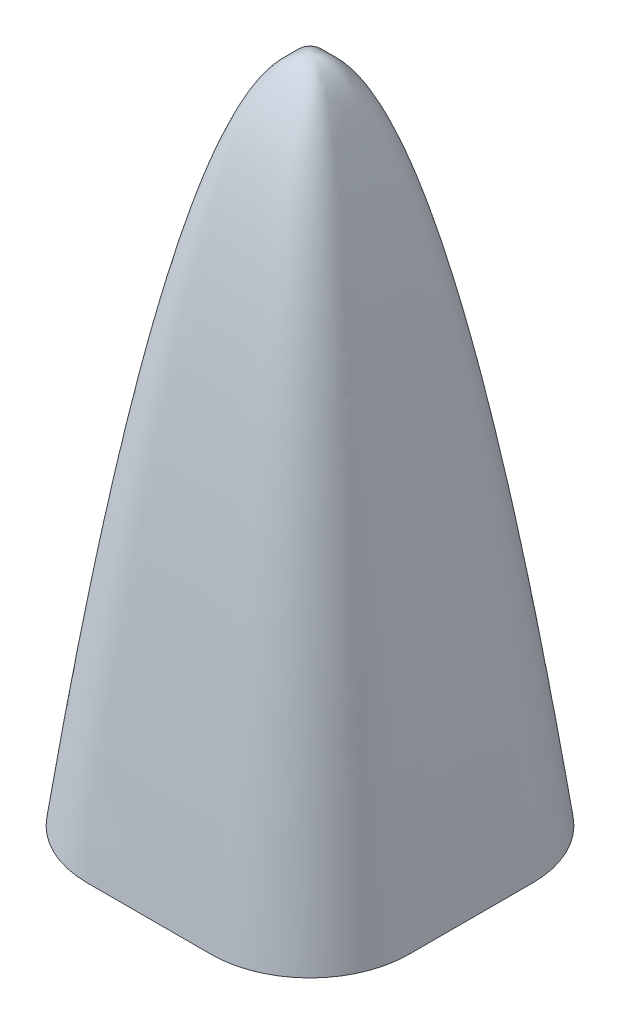
ISO-10303-21;
HEADER;
FILE_DESCRIPTION(('STEP AP214'),'2;1');
FILE_NAME('part.step','',(''),(''),'','','');
FILE_SCHEMA(('AUTOMOTIVE_DESIGN { 1 0 10303 214 1 1 1 1 }'));
ENDSEC;
DATA;
#1=APPLICATION_CONTEXT('core data for automotive mechanical design processes');
#2=APPLICATION_PROTOCOL_DEFINITION('international standard','automotive_design',2000,#1);
#3=PRODUCT_CONTEXT('',#1,'mechanical');
#4=PRODUCT('Part','Part','',(#3));
#5=PRODUCT_RELATED_PRODUCT_CATEGORY('part','',(#4));
#6=PRODUCT_DEFINITION_FORMATION('','',#4);
#7=PRODUCT_DEFINITION_CONTEXT('part definition',#1,'design');
#8=PRODUCT_DEFINITION('design','',#6,#7);
#9=PRODUCT_DEFINITION_SHAPE('','',#8);
#10=(LENGTH_UNIT() NAMED_UNIT(*) SI_UNIT(.MILLI.,.METRE.));
#11=(NAMED_UNIT(*) PLANE_ANGLE_UNIT() SI_UNIT($,.RADIAN.));
#12=(NAMED_UNIT(*) SI_UNIT($,.STERADIAN.) SOLID_ANGLE_UNIT());
#13=UNCERTAINTY_MEASURE_WITH_UNIT(LENGTH_MEASURE(1.E-05),#10,'distance_accuracy_value','');
#14=(GEOMETRIC_REPRESENTATION_CONTEXT(3) GLOBAL_UNCERTAINTY_ASSIGNED_CONTEXT((#13)) GLOBAL_UNIT_ASSIGNED_CONTEXT((#10,
#11,#12)) REPRESENTATION_CONTEXT('',''));
#15=CARTESIAN_POINT('',(0.,0.,0.));
#16=DIRECTION('',(0.,0.,1.));
#17=DIRECTION('',(1.,0.,0.));
#18=AXIS2_PLACEMENT_3D('',#15,#16,#17);
#19=CARTESIAN_POINT('',(-2.5,0.,2.5));
#20=DIRECTION('',(0.,1.,0.));
#21=DIRECTION('',(0.,0.,1.));
#22=AXIS2_PLACEMENT_3D('',#19,#20,#21);
#23=PLANE('',#22);
#24=DIRECTION('',(0.,0.,1.));
#25=VECTOR('',#24,1.);
#26=CARTESIAN_POINT('',(-6.5,0.,-2.49999999999997));
#27=LINE('',#26,#25);
#28=CARTESIAN_POINT('',(-6.5,0.,-2.49999999999997));
#29=VERTEX_POINT('',#28);
#30=CARTESIAN_POINT('',(-6.5,0.,2.49999999999997));
#31=VERTEX_POINT('',#30);
#32=EDGE_CURVE('E205',#29,#31,#27,.T.);
#33=ORIENTED_EDGE('',*,*,#32,.F.);
#34=CARTESIAN_POINT('',(-2.5,0.,-2.5));
#35=DIRECTION('',(0.,1.,0.));
#36=DIRECTION('',(0.,0.,1.));
#37=AXIS2_PLACEMENT_3D('',#34,#35,#36);
#38=CIRCLE('',#37,4.);
#39=CARTESIAN_POINT('',(-2.49999999999997,0.,-6.5));
#40=VERTEX_POINT('',#39);
#41=EDGE_CURVE('E13',#40,#29,#38,.T.);
#42=ORIENTED_EDGE('',*,*,#41,.F.);
#43=DIRECTION('',(1.,0.,0.));
#44=VECTOR('',#43,1.);
#45=CARTESIAN_POINT('',(-2.49999999999997,0.,-6.5));
#46=LINE('',#45,#44);
#47=CARTESIAN_POINT('',(2.49999999999997,0.,-6.5));
#48=VERTEX_POINT('',#47);
#49=EDGE_CURVE('E170',#40,#48,#46,.T.);
#50=ORIENTED_EDGE('',*,*,#49,.T.);
#51=CARTESIAN_POINT('',(2.5,0.,-2.5));
#52=DIRECTION('',(0.,1.,0.));
#53=DIRECTION('',(0.,0.,1.));
#54=AXIS2_PLACEMENT_3D('',#51,#52,#53);
#55=CIRCLE('',#54,4.);
#56=CARTESIAN_POINT('',(6.5,0.,-2.49999999999997));
#57=VERTEX_POINT('',#56);
#58=EDGE_CURVE('E264',#57,#48,#55,.T.);
#59=ORIENTED_EDGE('',*,*,#58,.F.);
#60=DIRECTION('',(0.,0.,1.));
#61=VECTOR('',#60,1.);
#62=CARTESIAN_POINT('',(6.5,0.,-2.49999999999997));
#63=LINE('',#62,#61);
#64=CARTESIAN_POINT('',(6.5,0.,2.49999999999997));
#65=VERTEX_POINT('',#64);
#66=EDGE_CURVE('E254',#57,#65,#63,.T.);
#67=ORIENTED_EDGE('',*,*,#66,.T.);
#68=CARTESIAN_POINT('',(2.5,0.,2.5));
#69=DIRECTION('',(0.,1.,0.));
#70=DIRECTION('',(0.,0.,1.));
#71=AXIS2_PLACEMENT_3D('',#68,#69,#70);
#72=CIRCLE('',#71,4.);
#73=CARTESIAN_POINT('',(2.49999999999997,0.,6.5));
#74=VERTEX_POINT('',#73);
#75=EDGE_CURVE('E243',#74,#65,#72,.T.);
#76=ORIENTED_EDGE('',*,*,#75,.F.);
#77=DIRECTION('',(1.,0.,0.));
#78=VECTOR('',#77,1.);
#79=CARTESIAN_POINT('',(-2.49999999999997,0.,6.5));
#80=LINE('',#79,#78);
#81=CARTESIAN_POINT('',(-2.5,0.,6.5));
#82=VERTEX_POINT('',#81);
#83=EDGE_CURVE('E204',#82,#74,#80,.T.);
#84=ORIENTED_EDGE('',*,*,#83,.F.);
#85=CARTESIAN_POINT('',(-2.5,0.,2.5));
#86=DIRECTION('',(0.,1.,0.));
#87=DIRECTION('',(0.,0.,1.));
#88=AXIS2_PLACEMENT_3D('',#85,#86,#87);
#89=CIRCLE('',#88,4.);
#90=EDGE_CURVE('E199',#31,#82,#89,.T.);
#91=ORIENTED_EDGE('',*,*,#90,.F.);
#92=EDGE_LOOP('',(#33,#42,#50,#59,#67,#76,#84,#91));
#93=FACE_BOUND('',#92,.T.);
#94=ADVANCED_FACE('F152',(#93),#23,.F.);
#95=CARTESIAN_POINT('',(6.5,0.,0.));
#96=CARTESIAN_POINT('',(4.33333333333333,18.,0.));
#97=CARTESIAN_POINT('',(2.16666666666667,27.,0.));
#98=CARTESIAN_POINT('',(0.,27.,0.));
#99=CARTESIAN_POINT('',(6.5,0.,-0.208333333333331));
#100=CARTESIAN_POINT('',(4.33333333333333,18.,-0.138888888888887));
#101=CARTESIAN_POINT('',(2.16666666666667,27.,-0.0694444444444437));
#102=CARTESIAN_POINT('',(0.,27.,0.));
#103=CARTESIAN_POINT('',(6.5,0.,-0.624999999999992));
#104=CARTESIAN_POINT('',(4.33333333333333,18.,-0.416666666666662));
#105=CARTESIAN_POINT('',(2.16666666666667,27.,-0.208333333333331));
#106=CARTESIAN_POINT('',(0.,27.,0.));
#107=CARTESIAN_POINT('',(6.5,0.,-1.24999999999999));
#108=CARTESIAN_POINT('',(4.33333333333334,18.,-0.833333333333324));
#109=CARTESIAN_POINT('',(2.16666666666667,27.,-0.416666666666662));
#110=CARTESIAN_POINT('',(0.,27.,0.));
#111=CARTESIAN_POINT('',(6.5,0.,-1.87499999999998));
#112=CARTESIAN_POINT('',(4.33333333333333,18.,-1.24999999999999));
#113=CARTESIAN_POINT('',(2.16666666666667,27.,-0.624999999999993));
#114=CARTESIAN_POINT('',(0.,27.,0.));
#115=CARTESIAN_POINT('',(6.5,0.,-2.29166666666664));
#116=CARTESIAN_POINT('',(4.33333333333333,18.,-1.52777777777776));
#117=CARTESIAN_POINT('',(2.16666666666667,27.,-0.76388888888888));
#118=CARTESIAN_POINT('',(0.,27.,0.));
#119=CARTESIAN_POINT('',(6.50000000000001,0.,-3.02359877219142));
#120=CARTESIAN_POINT('',(4.33333333333334,18.,-2.01573251479428));
#121=CARTESIAN_POINT('',(2.16666666666667,27.,-1.00786625739714));
#122=CARTESIAN_POINT('',(0.,27.,0.));
#123=CARTESIAN_POINT('',(6.29196002703282,0.,-4.07062167964767));
#124=CARTESIAN_POINT('',(4.19464001802188,18.,-2.71374778643178));
#125=CARTESIAN_POINT('',(2.09732000901094,27.,-1.35687389321589));
#126=CARTESIAN_POINT('',(0.,27.,0.));
#127=CARTESIAN_POINT('',(5.40212765733192,0.,-5.40212765733193));
#128=CARTESIAN_POINT('',(3.60141843822128,18.,-3.60141843822128));
#129=CARTESIAN_POINT('',(1.80070921911064,27.,-1.80070921911064));
#130=CARTESIAN_POINT('',(0.,27.,0.));
#131=CARTESIAN_POINT('',(4.07062167964768,0.,-6.29196002703281));
#132=CARTESIAN_POINT('',(2.71374778643178,18.,-4.19464001802187));
#133=CARTESIAN_POINT('',(1.35687389321589,27.,-2.09732000901094));
#134=CARTESIAN_POINT('',(0.,27.,0.));
#135=CARTESIAN_POINT('',(3.02359877219142,0.,-6.5));
#136=CARTESIAN_POINT('',(2.01573251479428,18.,-4.33333333333333));
#137=CARTESIAN_POINT('',(1.00786625739714,27.,-2.16666666666667));
#138=CARTESIAN_POINT('',(0.,27.,0.));
#139=CARTESIAN_POINT('',(2.08333333333331,0.,-6.5));
#140=CARTESIAN_POINT('',(1.38888888888887,18.,-4.33333333333333));
#141=CARTESIAN_POINT('',(0.694444444444437,27.,-2.16666666666667));
#142=CARTESIAN_POINT('',(0.,27.,0.));
#143=CARTESIAN_POINT('',(1.24999999999999,0.,-6.5));
#144=CARTESIAN_POINT('',(0.833333333333325,18.,-4.33333333333333));
#145=CARTESIAN_POINT('',(0.416666666666662,27.,-2.16666666666667));
#146=CARTESIAN_POINT('',(0.,27.,0.));
#147=CARTESIAN_POINT('',(0.,0.,-6.5));
#148=CARTESIAN_POINT('',(0.,18.,-4.33333333333333));
#149=CARTESIAN_POINT('',(0.,27.,-2.16666666666667));
#150=CARTESIAN_POINT('',(0.,27.,0.));
#151=CARTESIAN_POINT('',(-1.24999999999998,0.,-6.5));
#152=CARTESIAN_POINT('',(-0.833333333333322,18.,-4.33333333333333));
#153=CARTESIAN_POINT('',(-0.416666666666661,27.,-2.16666666666667));
#154=CARTESIAN_POINT('',(0.,27.,0.));
#155=CARTESIAN_POINT('',(-2.08333333333331,0.,-6.5));
#156=CARTESIAN_POINT('',(-1.38888888888887,18.,-4.33333333333333));
#157=CARTESIAN_POINT('',(-0.694444444444437,27.,-2.16666666666667));
#158=CARTESIAN_POINT('',(0.,27.,0.));
#159=CARTESIAN_POINT('',(-3.02359877219142,0.,-6.5));
#160=CARTESIAN_POINT('',(-2.01573251479428,18.,-4.33333333333334));
#161=CARTESIAN_POINT('',(-1.00786625739714,27.,-2.16666666666667));
#162=CARTESIAN_POINT('',(0.,27.,0.));
#163=CARTESIAN_POINT('',(-4.07062167964768,0.,-6.29196002703281));
#164=CARTESIAN_POINT('',(-2.71374778643179,18.,-4.19464001802187));
#165=CARTESIAN_POINT('',(-1.35687389321589,27.,-2.09732000901094));
#166=CARTESIAN_POINT('',(0.,27.,0.));
#167=CARTESIAN_POINT('',(-5.40212765733191,0.,-5.40212765733192));
#168=CARTESIAN_POINT('',(-3.60141843822127,18.,-3.60141843822128));
#169=CARTESIAN_POINT('',(-1.80070921911064,27.,-1.80070921911064));
#170=CARTESIAN_POINT('',(0.,27.,0.));
#171=CARTESIAN_POINT('',(-6.29196002703282,0.,-4.07062167964767));
#172=CARTESIAN_POINT('',(-4.19464001802188,18.,-2.71374778643178));
#173=CARTESIAN_POINT('',(-2.09732000901094,27.,-1.35687389321589));
#174=CARTESIAN_POINT('',(0.,27.,0.));
#175=CARTESIAN_POINT('',(-6.5,0.,-3.02359877219142));
#176=CARTESIAN_POINT('',(-4.33333333333334,18.,-2.01573251479428));
#177=CARTESIAN_POINT('',(-2.16666666666667,27.,-1.00786625739714));
#178=CARTESIAN_POINT('',(0.,27.,0.));
#179=CARTESIAN_POINT('',(-6.5,0.,-2.08333333333331));
#180=CARTESIAN_POINT('',(-4.33333333333333,18.,-1.38888888888887));
#181=CARTESIAN_POINT('',(-2.16666666666667,27.,-0.694444444444436));
#182=CARTESIAN_POINT('',(0.,27.,0.));
#183=CARTESIAN_POINT('',(-6.5,0.,-1.24999999999999));
#184=CARTESIAN_POINT('',(-4.33333333333333,18.,-0.833333333333324));
#185=CARTESIAN_POINT('',(-2.16666666666667,27.,-0.416666666666662));
#186=CARTESIAN_POINT('',(0.,27.,0.));
#187=CARTESIAN_POINT('',(-6.5,0.,0.));
#188=CARTESIAN_POINT('',(-4.33333333333333,18.,0.));
#189=CARTESIAN_POINT('',(-2.16666666666667,27.,0.));
#190=CARTESIAN_POINT('',(0.,27.,0.));
#191=CARTESIAN_POINT('',(-6.50000000000001,0.,1.24999999999999));
#192=CARTESIAN_POINT('',(-4.33333333333334,18.,0.833333333333324));
#193=CARTESIAN_POINT('',(-2.16666666666667,27.,0.416666666666662));
#194=CARTESIAN_POINT('',(0.,27.,0.));
#195=CARTESIAN_POINT('',(-6.5,0.,2.08333333333331));
#196=CARTESIAN_POINT('',(-4.33333333333333,18.,1.38888888888887));
#197=CARTESIAN_POINT('',(-2.16666666666667,27.,0.694444444444436));
#198=CARTESIAN_POINT('',(0.,27.,0.));
#199=CARTESIAN_POINT('',(-6.5,0.,3.02359877219142));
#200=CARTESIAN_POINT('',(-4.33333333333334,18.,2.01573251479428));
#201=CARTESIAN_POINT('',(-2.16666666666667,27.,1.00786625739714));
#202=CARTESIAN_POINT('',(0.,27.,0.));
#203=CARTESIAN_POINT('',(-6.29196002703282,0.,4.07062167964766));
#204=CARTESIAN_POINT('',(-4.19464001802188,18.,2.71374778643177));
#205=CARTESIAN_POINT('',(-2.09732000901094,27.,1.35687389321589));
#206=CARTESIAN_POINT('',(0.,27.,0.));
#207=CARTESIAN_POINT('',(-5.40212765733193,0.,5.40212765733191));
#208=CARTESIAN_POINT('',(-3.60141843822129,18.,3.60141843822127));
#209=CARTESIAN_POINT('',(-1.80070921911064,27.,1.80070921911064));
#210=CARTESIAN_POINT('',(0.,27.,0.));
#211=CARTESIAN_POINT('',(-4.07062167964769,0.,6.2919600270328));
#212=CARTESIAN_POINT('',(-2.71374778643179,18.,4.19464001802187));
#213=CARTESIAN_POINT('',(-1.3568738932159,27.,2.09732000901093));
#214=CARTESIAN_POINT('',(0.,27.,0.));
#215=CARTESIAN_POINT('',(-3.02359877219145,0.,6.5));
#216=CARTESIAN_POINT('',(-2.0157325147943,18.,4.33333333333333));
#217=CARTESIAN_POINT('',(-1.00786625739715,27.,2.16666666666667));
#218=CARTESIAN_POINT('',(0.,27.,0.));
#219=CARTESIAN_POINT('',(-2.08333333333334,0.,6.5));
#220=CARTESIAN_POINT('',(-1.38888888888889,18.,4.33333333333333));
#221=CARTESIAN_POINT('',(-0.694444444444445,27.,2.16666666666667));
#222=CARTESIAN_POINT('',(0.,27.,0.));
#223=CARTESIAN_POINT('',(-1.25000000000001,0.,6.49999999999999));
#224=CARTESIAN_POINT('',(-0.833333333333338,18.,4.33333333333333));
#225=CARTESIAN_POINT('',(-0.416666666666669,27.,2.16666666666666));
#226=CARTESIAN_POINT('',(0.,27.,0.));
#227=CARTESIAN_POINT('',(0.,0.,6.50000000000001));
#228=CARTESIAN_POINT('',(0.,18.,4.33333333333334));
#229=CARTESIAN_POINT('',(0.,27.,2.16666666666667));
#230=CARTESIAN_POINT('',(0.,27.,0.));
#231=CARTESIAN_POINT('',(1.24999999999998,0.,6.5));
#232=CARTESIAN_POINT('',(0.833333333333319,18.,4.33333333333333));
#233=CARTESIAN_POINT('',(0.416666666666659,27.,2.16666666666667));
#234=CARTESIAN_POINT('',(0.,27.,0.));
#235=CARTESIAN_POINT('',(2.08333333333331,0.,6.5));
#236=CARTESIAN_POINT('',(1.38888888888887,18.,4.33333333333333));
#237=CARTESIAN_POINT('',(0.694444444444436,27.,2.16666666666667));
#238=CARTESIAN_POINT('',(0.,27.,0.));
#239=CARTESIAN_POINT('',(3.02359877219142,0.,6.5));
#240=CARTESIAN_POINT('',(2.01573251479428,18.,4.33333333333334));
#241=CARTESIAN_POINT('',(1.00786625739714,27.,2.16666666666667));
#242=CARTESIAN_POINT('',(0.,27.,0.));
#243=CARTESIAN_POINT('',(4.07062167964767,0.,6.29196002703282));
#244=CARTESIAN_POINT('',(2.71374778643178,18.,4.19464001802188));
#245=CARTESIAN_POINT('',(1.35687389321589,27.,2.09732000901094));
#246=CARTESIAN_POINT('',(0.,27.,0.));
#247=CARTESIAN_POINT('',(5.40212765733192,0.,5.40212765733192));
#248=CARTESIAN_POINT('',(3.60141843822128,18.,3.60141843822128));
#249=CARTESIAN_POINT('',(1.80070921911064,27.,1.80070921911064));
#250=CARTESIAN_POINT('',(0.,27.,0.));
#251=CARTESIAN_POINT('',(6.29196002703282,0.,4.07062167964767));
#252=CARTESIAN_POINT('',(4.19464001802188,18.,2.71374778643178));
#253=CARTESIAN_POINT('',(2.09732000901094,27.,1.35687389321589));
#254=CARTESIAN_POINT('',(0.,27.,0.));
#255=CARTESIAN_POINT('',(6.5,0.,3.02359877219142));
#256=CARTESIAN_POINT('',(4.33333333333334,18.,2.01573251479428));
#257=CARTESIAN_POINT('',(2.16666666666667,27.,1.00786625739714));
#258=CARTESIAN_POINT('',(0.,27.,0.));
#259=CARTESIAN_POINT('',(6.5,0.,2.29166666666664));
#260=CARTESIAN_POINT('',(4.33333333333333,18.,1.52777777777776));
#261=CARTESIAN_POINT('',(2.16666666666667,27.,0.76388888888888));
#262=CARTESIAN_POINT('',(0.,27.,0.));
#263=CARTESIAN_POINT('',(6.50000000000001,0.,1.87499999999998));
#264=CARTESIAN_POINT('',(4.33333333333334,18.,1.24999999999999));
#265=CARTESIAN_POINT('',(2.16666666666667,27.,0.624999999999993));
#266=CARTESIAN_POINT('',(0.,27.,0.));
#267=CARTESIAN_POINT('',(6.49999999999999,0.,1.24999999999998));
#268=CARTESIAN_POINT('',(4.33333333333333,18.,0.833333333333323));
#269=CARTESIAN_POINT('',(2.16666666666666,27.,0.416666666666661));
#270=CARTESIAN_POINT('',(0.,27.,0.));
#271=CARTESIAN_POINT('',(6.50000000000001,0.,0.624999999999994));
#272=CARTESIAN_POINT('',(4.33333333333334,18.,0.416666666666663));
#273=CARTESIAN_POINT('',(2.16666666666667,27.,0.208333333333331));
#274=CARTESIAN_POINT('',(0.,27.,0.));
#275=CARTESIAN_POINT('',(6.5,0.,0.208333333333332));
#276=CARTESIAN_POINT('',(4.33333333333333,18.,0.138888888888888));
#277=CARTESIAN_POINT('',(2.16666666666667,27.,0.0694444444444439));
#278=CARTESIAN_POINT('',(0.,27.,0.));
#279=CARTESIAN_POINT('',(6.5,0.,0.));
#280=CARTESIAN_POINT('',(4.33333333333333,18.,0.));
#281=CARTESIAN_POINT('',(2.16666666666667,27.,0.));
#282=CARTESIAN_POINT('',(0.,27.,0.));
#283=B_SPLINE_SURFACE_WITH_KNOTS('',3,3,((#95,#96,#97,#98),(#99,#100,#101,#102),(#103,#104,#105,
#106),(#107,#108,#109,#110),(#111,#112,#113,#114),(#115,#116,#117,#118),(#119,#120,#121,#122),
(#123,#124,#125,#126),(#127,#128,#129,#130),(#131,#132,#133,#134),(#135,#136,#137,#138),(#139,
#140,#141,#142),(#143,#144,#145,#146),(#147,#148,#149,#150),(#151,#152,#153,#154),(#155,#156,
#157,#158),(#159,#160,#161,#162),(#163,#164,#165,#166),(#167,#168,#169,#170),(#171,#172,#173,
#174),(#175,#176,#177,#178),(#179,#180,#181,#182),(#183,#184,#185,#186),(#187,#188,#189,#190),
(#191,#192,#193,#194),(#195,#196,#197,#198),(#199,#200,#201,#202),(#203,#204,#205,#206),(#207,
#208,#209,#210),(#211,#212,#213,#214),(#215,#216,#217,#218),(#219,#220,#221,#222),(#223,#224,
#225,#226),(#227,#228,#229,#230),(#231,#232,#233,#234),(#235,#236,#237,#238),(#239,#240,#241,
#242),(#243,#244,#245,#246),(#247,#248,#249,#250),(#251,#252,#253,#254),(#255,#256,#257,#258),
(#259,#260,#261,#262),(#263,#264,#265,#266),(#267,#268,#269,#270),(#271,#272,#273,#274),(#275,
#276,#277,#278),(#279,#280,#281,#282)),.UNSPECIFIED.,.T.,.F.,.F.,(4,1,1,1,2,1,1,1,2,1,1,1,2,1,1,
1,2,1,1,1,2,1,1,1,2,1,1,1,2,1,1,1,2,1,1,1,4),(4,4),(0.,0.0138480398704943,0.0276960797409886,
0.0415441196114829,0.0553921594819771,0.0901960797409886,0.125,0.159803920259011,
0.194607840518023,0.222303920259011,0.25,0.277696079740989,0.305392159481977,0.340196079740989,
0.375,0.409803920259011,0.444607840518023,0.472303920259011,0.5,0.527696079740989,
0.555392159481977,0.590196079740988,0.625,0.659803920259011,0.694607840518022,0.722303920259011,
0.75,0.777696079740988,0.805392159481977,0.840196079740988,0.875,0.909803920259012,
0.944607840518023,0.958455880388517,0.972303920259012,0.986151960129506,1.),(0.,1.),.UNSPECIFIED.);
#284=CARTESIAN_POINT('',(0.,0.,6.5));
#285=CARTESIAN_POINT('',(0.,18.,4.33333333333333));
#286=CARTESIAN_POINT('',(0.,27.,2.16666666666667));
#287=CARTESIAN_POINT('',(0.,27.,0.));
#288=CARTESIAN_POINT('',(0.416666666666648,0.,6.5));
#289=CARTESIAN_POINT('',(0.277777777777765,18.,4.33333333333333));
#290=CARTESIAN_POINT('',(0.138888888888882,27.,2.16666666666667));
#291=CARTESIAN_POINT('',(0.,27.,0.));
#292=CARTESIAN_POINT('',(1.24999999999998,0.,6.5));
#293=CARTESIAN_POINT('',(0.833333333333319,18.,4.33333333333333));
#294=CARTESIAN_POINT('',(0.416666666666659,27.,2.16666666666667));
#295=CARTESIAN_POINT('',(0.,27.,0.));
#296=CARTESIAN_POINT('',(2.08333333333331,0.,6.5));
#297=CARTESIAN_POINT('',(1.38888888888887,18.,4.33333333333333));
#298=CARTESIAN_POINT('',(0.694444444444436,27.,2.16666666666667));
#299=CARTESIAN_POINT('',(0.,27.,0.));
#300=CARTESIAN_POINT('',(3.02359877219142,0.,6.5));
#301=CARTESIAN_POINT('',(2.01573251479428,18.,4.33333333333334));
#302=CARTESIAN_POINT('',(1.00786625739714,27.,2.16666666666667));
#303=CARTESIAN_POINT('',(0.,27.,0.));
#304=CARTESIAN_POINT('',(4.07062167964767,0.,6.29196002703282));
#305=CARTESIAN_POINT('',(2.71374778643178,18.,4.19464001802188));
#306=CARTESIAN_POINT('',(1.35687389321589,27.,2.09732000901094));
#307=CARTESIAN_POINT('',(0.,27.,0.));
#308=CARTESIAN_POINT('',(5.40212765733192,0.,5.40212765733192));
#309=CARTESIAN_POINT('',(3.60141843822128,18.,3.60141843822128));
#310=CARTESIAN_POINT('',(1.80070921911064,27.,1.80070921911064));
#311=CARTESIAN_POINT('',(0.,27.,0.));
#312=CARTESIAN_POINT('',(6.29196002703282,0.,4.07062167964767));
#313=CARTESIAN_POINT('',(4.19464001802188,18.,2.71374778643178));
#314=CARTESIAN_POINT('',(2.09732000901094,27.,1.35687389321589));
#315=CARTESIAN_POINT('',(0.,27.,0.));
#316=CARTESIAN_POINT('',(6.5,0.,3.02359877219142));
#317=CARTESIAN_POINT('',(4.33333333333334,18.,2.01573251479428));
#318=CARTESIAN_POINT('',(2.16666666666667,27.,1.00786625739714));
#319=CARTESIAN_POINT('',(0.,27.,0.));
#320=CARTESIAN_POINT('',(6.5,0.,2.29166666666664));
#321=CARTESIAN_POINT('',(4.33333333333333,18.,1.52777777777776));
#322=CARTESIAN_POINT('',(2.16666666666667,27.,0.76388888888888));
#323=CARTESIAN_POINT('',(0.,27.,0.));
#324=CARTESIAN_POINT('',(6.50000000000001,0.,1.87499999999998));
#325=CARTESIAN_POINT('',(4.33333333333334,18.,1.24999999999999));
#326=CARTESIAN_POINT('',(2.16666666666667,27.,0.624999999999993));
#327=CARTESIAN_POINT('',(0.,27.,0.));
#328=CARTESIAN_POINT('',(6.49999999999999,0.,1.24999999999998));
#329=CARTESIAN_POINT('',(4.33333333333333,18.,0.833333333333323));
#330=CARTESIAN_POINT('',(2.16666666666666,27.,0.416666666666661));
#331=CARTESIAN_POINT('',(0.,27.,0.));
#332=CARTESIAN_POINT('',(6.50000000000001,0.,0.624999999999994));
#333=CARTESIAN_POINT('',(4.33333333333334,18.,0.416666666666663));
#334=CARTESIAN_POINT('',(2.16666666666667,27.,0.208333333333331));
#335=CARTESIAN_POINT('',(0.,27.,0.));
#336=CARTESIAN_POINT('',(6.5,0.,0.208333333333332));
#337=CARTESIAN_POINT('',(4.33333333333333,18.,0.138888888888888));
#338=CARTESIAN_POINT('',(2.16666666666667,27.,0.0694444444444439));
#339=CARTESIAN_POINT('',(0.,27.,0.));
#340=CARTESIAN_POINT('',(6.5,0.,0.));
#341=CARTESIAN_POINT('',(4.33333333333333,18.,0.));
#342=CARTESIAN_POINT('',(2.16666666666667,27.,0.));
#343=CARTESIAN_POINT('',(0.,27.,0.));
#344=CARTESIAN_POINT('',(6.5,0.,-0.208333333333331));
#345=CARTESIAN_POINT('',(4.33333333333333,18.,-0.138888888888887));
#346=CARTESIAN_POINT('',(2.16666666666667,27.,-0.0694444444444437));
#347=CARTESIAN_POINT('',(0.,27.,0.));
#348=CARTESIAN_POINT('',(6.5,0.,-0.624999999999992));
#349=CARTESIAN_POINT('',(4.33333333333333,18.,-0.416666666666662));
#350=CARTESIAN_POINT('',(2.16666666666667,27.,-0.208333333333331));
#351=CARTESIAN_POINT('',(0.,27.,0.));
#352=CARTESIAN_POINT('',(6.5,0.,-1.24999999999999));
#353=CARTESIAN_POINT('',(4.33333333333334,18.,-0.833333333333324));
#354=CARTESIAN_POINT('',(2.16666666666667,27.,-0.416666666666662));
#355=CARTESIAN_POINT('',(0.,27.,0.));
#356=CARTESIAN_POINT('',(6.5,0.,-1.87499999999998));
#357=CARTESIAN_POINT('',(4.33333333333333,18.,-1.24999999999999));
#358=CARTESIAN_POINT('',(2.16666666666667,27.,-0.624999999999993));
#359=CARTESIAN_POINT('',(0.,27.,0.));
#360=CARTESIAN_POINT('',(6.5,0.,-2.29166666666664));
#361=CARTESIAN_POINT('',(4.33333333333333,18.,-1.52777777777776));
#362=CARTESIAN_POINT('',(2.16666666666667,27.,-0.76388888888888));
#363=CARTESIAN_POINT('',(0.,27.,0.));
#364=CARTESIAN_POINT('',(6.50000000000001,0.,-3.02359877219142));
#365=CARTESIAN_POINT('',(4.33333333333334,18.,-2.01573251479428));
#366=CARTESIAN_POINT('',(2.16666666666667,27.,-1.00786625739714));
#367=CARTESIAN_POINT('',(0.,27.,0.));
#368=CARTESIAN_POINT('',(6.29196002703282,0.,-4.07062167964767));
#369=CARTESIAN_POINT('',(4.19464001802188,18.,-2.71374778643178));
#370=CARTESIAN_POINT('',(2.09732000901094,27.,-1.35687389321589));
#371=CARTESIAN_POINT('',(0.,27.,0.));
#372=CARTESIAN_POINT('',(5.40212765733192,0.,-5.40212765733193));
#373=CARTESIAN_POINT('',(3.60141843822128,18.,-3.60141843822128));
#374=CARTESIAN_POINT('',(1.80070921911064,27.,-1.80070921911064));
#375=CARTESIAN_POINT('',(0.,27.,0.));
#376=CARTESIAN_POINT('',(4.07062167964768,0.,-6.29196002703281));
#377=CARTESIAN_POINT('',(2.71374778643178,18.,-4.19464001802187));
#378=CARTESIAN_POINT('',(1.35687389321589,27.,-2.09732000901094));
#379=CARTESIAN_POINT('',(0.,27.,0.));
#380=CARTESIAN_POINT('',(3.02359877219142,0.,-6.5));
#381=CARTESIAN_POINT('',(2.01573251479428,18.,-4.33333333333333));
#382=CARTESIAN_POINT('',(1.00786625739714,27.,-2.16666666666667));
#383=CARTESIAN_POINT('',(0.,27.,0.));
#384=CARTESIAN_POINT('',(2.08333333333331,0.,-6.5));
#385=CARTESIAN_POINT('',(1.38888888888887,18.,-4.33333333333333));
#386=CARTESIAN_POINT('',(0.694444444444437,27.,-2.16666666666667));
#387=CARTESIAN_POINT('',(0.,27.,0.));
#388=CARTESIAN_POINT('',(1.24999999999999,0.,-6.5));
#389=CARTESIAN_POINT('',(0.833333333333325,18.,-4.33333333333333));
#390=CARTESIAN_POINT('',(0.416666666666662,27.,-2.16666666666667));
#391=CARTESIAN_POINT('',(0.,27.,0.));
#392=CARTESIAN_POINT('',(0.,0.,-6.5));
#393=CARTESIAN_POINT('',(0.,18.,-4.33333333333333));
#394=CARTESIAN_POINT('',(0.,27.,-2.16666666666667));
#395=CARTESIAN_POINT('',(0.,27.,0.));
#396=CARTESIAN_POINT('',(-1.24999999999998,0.,-6.5));
#397=CARTESIAN_POINT('',(-0.833333333333322,18.,-4.33333333333333));
#398=CARTESIAN_POINT('',(-0.416666666666661,27.,-2.16666666666667));
#399=CARTESIAN_POINT('',(0.,27.,0.));
#400=CARTESIAN_POINT('',(-2.08333333333331,0.,-6.5));
#401=CARTESIAN_POINT('',(-1.38888888888887,18.,-4.33333333333333));
#402=CARTESIAN_POINT('',(-0.694444444444437,27.,-2.16666666666667));
#403=CARTESIAN_POINT('',(0.,27.,0.));
#404=CARTESIAN_POINT('',(-3.02359877219142,0.,-6.5));
#405=CARTESIAN_POINT('',(-2.01573251479428,18.,-4.33333333333334));
#406=CARTESIAN_POINT('',(-1.00786625739714,27.,-2.16666666666667));
#407=CARTESIAN_POINT('',(0.,27.,0.));
#408=CARTESIAN_POINT('',(-4.07062167964768,0.,-6.29196002703281));
#409=CARTESIAN_POINT('',(-2.71374778643179,18.,-4.19464001802187));
#410=CARTESIAN_POINT('',(-1.35687389321589,27.,-2.09732000901094));
#411=CARTESIAN_POINT('',(0.,27.,0.));
#412=CARTESIAN_POINT('',(-5.40212765733191,0.,-5.40212765733192));
#413=CARTESIAN_POINT('',(-3.60141843822127,18.,-3.60141843822128));
#414=CARTESIAN_POINT('',(-1.80070921911064,27.,-1.80070921911064));
#415=CARTESIAN_POINT('',(0.,27.,0.));
#416=CARTESIAN_POINT('',(-6.29196002703282,0.,-4.07062167964767));
#417=CARTESIAN_POINT('',(-4.19464001802188,18.,-2.71374778643178));
#418=CARTESIAN_POINT('',(-2.09732000901094,27.,-1.35687389321589));
#419=CARTESIAN_POINT('',(0.,27.,0.));
#420=CARTESIAN_POINT('',(-6.5,0.,-3.02359877219142));
#421=CARTESIAN_POINT('',(-4.33333333333334,18.,-2.01573251479428));
#422=CARTESIAN_POINT('',(-2.16666666666667,27.,-1.00786625739714));
#423=CARTESIAN_POINT('',(0.,27.,0.));
#424=CARTESIAN_POINT('',(-6.5,0.,-2.08333333333331));
#425=CARTESIAN_POINT('',(-4.33333333333333,18.,-1.38888888888887));
#426=CARTESIAN_POINT('',(-2.16666666666667,27.,-0.694444444444436));
#427=CARTESIAN_POINT('',(0.,27.,0.));
#428=CARTESIAN_POINT('',(-6.5,0.,-1.24999999999999));
#429=CARTESIAN_POINT('',(-4.33333333333333,18.,-0.833333333333324));
#430=CARTESIAN_POINT('',(-2.16666666666667,27.,-0.416666666666662));
#431=CARTESIAN_POINT('',(0.,27.,0.));
#432=CARTESIAN_POINT('',(-6.5,0.,0.));
#433=CARTESIAN_POINT('',(-4.33333333333333,18.,0.));
#434=CARTESIAN_POINT('',(-2.16666666666667,27.,0.));
#435=CARTESIAN_POINT('',(0.,27.,0.));
#436=CARTESIAN_POINT('',(-6.50000000000001,0.,1.24999999999999));
#437=CARTESIAN_POINT('',(-4.33333333333334,18.,0.833333333333324));
#438=CARTESIAN_POINT('',(-2.16666666666667,27.,0.416666666666662));
#439=CARTESIAN_POINT('',(0.,27.,0.));
#440=CARTESIAN_POINT('',(-6.5,0.,2.08333333333331));
#441=CARTESIAN_POINT('',(-4.33333333333333,18.,1.38888888888887));
#442=CARTESIAN_POINT('',(-2.16666666666667,27.,0.694444444444436));
#443=CARTESIAN_POINT('',(0.,27.,0.));
#444=CARTESIAN_POINT('',(-6.5,0.,3.02359877219142));
#445=CARTESIAN_POINT('',(-4.33333333333334,18.,2.01573251479428));
#446=CARTESIAN_POINT('',(-2.16666666666667,27.,1.00786625739714));
#447=CARTESIAN_POINT('',(0.,27.,0.));
#448=CARTESIAN_POINT('',(-6.29196002703282,0.,4.07062167964766));
#449=CARTESIAN_POINT('',(-4.19464001802188,18.,2.71374778643177));
#450=CARTESIAN_POINT('',(-2.09732000901094,27.,1.35687389321589));
#451=CARTESIAN_POINT('',(0.,27.,0.));
#452=CARTESIAN_POINT('',(-5.40212765733193,0.,5.40212765733191));
#453=CARTESIAN_POINT('',(-3.60141843822129,18.,3.60141843822127));
#454=CARTESIAN_POINT('',(-1.80070921911064,27.,1.80070921911064));
#455=CARTESIAN_POINT('',(0.,27.,0.));
#456=CARTESIAN_POINT('',(-4.07062167964769,0.,6.2919600270328));
#457=CARTESIAN_POINT('',(-2.71374778643179,18.,4.19464001802187));
#458=CARTESIAN_POINT('',(-1.3568738932159,27.,2.09732000901093));
#459=CARTESIAN_POINT('',(0.,27.,0.));
#460=CARTESIAN_POINT('',(-3.02359877219145,0.,6.5));
#461=CARTESIAN_POINT('',(-2.0157325147943,18.,4.33333333333333));
#462=CARTESIAN_POINT('',(-1.00786625739715,27.,2.16666666666667));
#463=CARTESIAN_POINT('',(0.,27.,0.));
#464=CARTESIAN_POINT('',(-2.08333333333334,0.,6.5));
#465=CARTESIAN_POINT('',(-1.38888888888889,18.,4.33333333333333));
#466=CARTESIAN_POINT('',(-0.694444444444445,27.,2.16666666666667));
#467=CARTESIAN_POINT('',(0.,27.,0.));
#468=CARTESIAN_POINT('',(-1.25000000000001,0.,6.49999999999999));
#469=CARTESIAN_POINT('',(-0.833333333333338,18.,4.33333333333333));
#470=CARTESIAN_POINT('',(-0.416666666666669,27.,2.16666666666666));
#471=CARTESIAN_POINT('',(0.,27.,0.));
#472=CARTESIAN_POINT('',(-0.41666666666668,0.,6.5));
#473=CARTESIAN_POINT('',(-0.277777777777787,18.,4.33333333333333));
#474=CARTESIAN_POINT('',(-0.138888888888893,27.,2.16666666666667));
#475=CARTESIAN_POINT('',(0.,27.,0.));
#476=CARTESIAN_POINT('',(0.,0.,6.5));
#477=CARTESIAN_POINT('',(0.,18.,4.33333333333333));
#478=CARTESIAN_POINT('',(0.,27.,2.16666666666667));
#479=CARTESIAN_POINT('',(0.,27.,0.));
#480=B_SPLINE_SURFACE_WITH_KNOTS('',3,3,((#284,#285,#286,#287),(#288,#289,#290,#291),(#292,#293,
#294,#295),(#296,#297,#298,#299),(#300,#301,#302,#303),(#304,#305,#306,#307),(#308,#309,#310,
#311),(#312,#313,#314,#315),(#316,#317,#318,#319),(#320,#321,#322,#323),(#324,#325,#326,#327),
(#328,#329,#330,#331),(#332,#333,#334,#335),(#336,#337,#338,#339),(#340,#341,#342,#343),(#344,
#345,#346,#347),(#348,#349,#350,#351),(#352,#353,#354,#355),(#356,#357,#358,#359),(#360,#361,
#362,#363),(#364,#365,#366,#367),(#368,#369,#370,#371),(#372,#373,#374,#375),(#376,#377,#378,
#379),(#380,#381,#382,#383),(#384,#385,#386,#387),(#388,#389,#390,#391),(#392,#393,#394,#395),
(#396,#397,#398,#399),(#400,#401,#402,#403),(#404,#405,#406,#407),(#408,#409,#410,#411),(#412,
#413,#414,#415),(#416,#417,#418,#419),(#420,#421,#422,#423),(#424,#425,#426,#427),(#428,#429,
#430,#431),(#432,#433,#434,#435),(#436,#437,#438,#439),(#440,#441,#442,#443),(#444,#445,#446,
#447),(#448,#449,#450,#451),(#452,#453,#454,#455),(#456,#457,#458,#459),(#460,#461,#462,#463),
(#464,#465,#466,#467),(#468,#469,#470,#471),(#472,#473,#474,#475),(#476,#477,#478,#479)),
.UNSPECIFIED.,.T.,.F.,.F.,(4,1,2,1,1,1,2,1,1,1,3,1,1,1,2,1,1,1,2,1,1,1,2,1,1,1,2,1,1,1,2,1,1,1,
2,1,4),(4,4),(0.75,0.777696079740988,0.805392159481977,0.840196079740988,0.875,
0.909803920259012,0.944607840518023,0.958455880388517,0.972303920259012,0.986151960129506,1.,
1.01384803987049,1.02769607974099,1.04154411961148,1.05539215948198,1.09019607974099,1.125,
1.15980392025901,1.19460784051802,1.22230392025901,1.25,1.27769607974099,1.30539215948198,
1.34019607974099,1.375,1.40980392025901,1.44460784051802,1.47230392025901,1.5,1.52769607974099,
1.55539215948198,1.59019607974099,1.625,1.65980392025901,1.69460784051802,1.72230392025901,
1.75),(0.,1.),.UNSPECIFIED.);
#481=CARTESIAN_POINT('',(0.,27.,0.));
#482=VERTEX_POINT('',#481);
#483=VERTEX_LOOP('',#482);
#484=FACE_BOUND('',#483,.T.);
#485=ORIENTED_EDGE('',*,*,#41,.T.);
#486=ORIENTED_EDGE('',*,*,#32,.T.);
#487=ORIENTED_EDGE('',*,*,#90,.T.);
#488=ORIENTED_EDGE('',*,*,#83,.T.);
#489=ORIENTED_EDGE('',*,*,#75,.T.);
#490=ORIENTED_EDGE('',*,*,#66,.F.);
#491=ORIENTED_EDGE('',*,*,#58,.T.);
#492=ORIENTED_EDGE('',*,*,#49,.F.);
#493=EDGE_LOOP('',(#485,#486,#487,#488,#489,#490,#491,#492));
#494=FACE_BOUND('',#493,.T.);
#495=ADVANCED_FACE('F156',(#484,#494),#480,.T.);
#496=CLOSED_SHELL('',(#94,#495));
#497=MANIFOLD_SOLID_BREP('B2',#496);
#498=ADVANCED_BREP_SHAPE_REPRESENTATION('',(#18,#497),#14);
#499=SHAPE_DEFINITION_REPRESENTATION(#9,#498);
ENDSEC;
END-ISO-10303-21;
